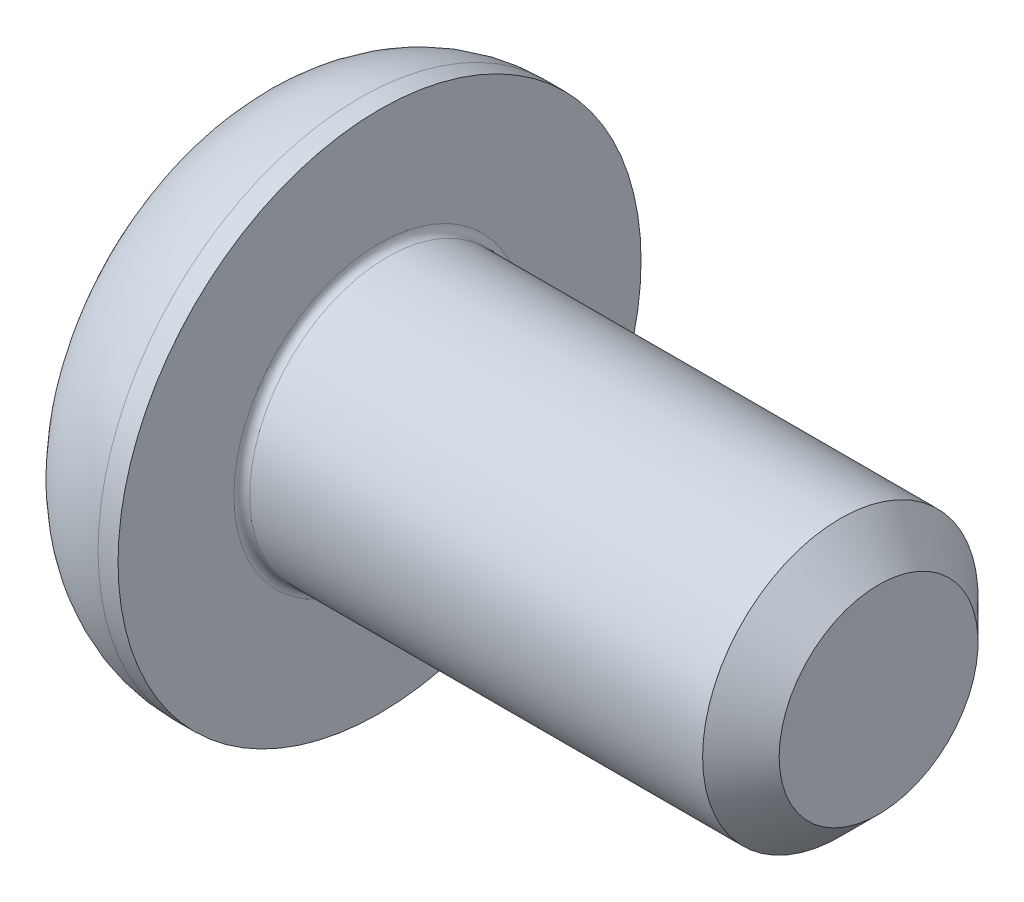
ISO-10303-21;
HEADER;
FILE_DESCRIPTION(('STEP AP214'),'2;1');
FILE_NAME('part.step','',(''),(''),'','','');
FILE_SCHEMA(('AUTOMOTIVE_DESIGN { 1 0 10303 214 1 1 1 1 }'));
ENDSEC;
DATA;
#1=APPLICATION_CONTEXT('core data for automotive mechanical design processes');
#2=APPLICATION_PROTOCOL_DEFINITION('international standard','automotive_design',2000,#1);
#3=PRODUCT_CONTEXT('',#1,'mechanical');
#4=PRODUCT('Part','Part','',(#3));
#5=PRODUCT_RELATED_PRODUCT_CATEGORY('part','',(#4));
#6=PRODUCT_DEFINITION_FORMATION('','',#4);
#7=PRODUCT_DEFINITION_CONTEXT('part definition',#1,'design');
#8=PRODUCT_DEFINITION('design','',#6,#7);
#9=PRODUCT_DEFINITION_SHAPE('','',#8);
#10=(LENGTH_UNIT() NAMED_UNIT(*) SI_UNIT(.MILLI.,.METRE.));
#11=(NAMED_UNIT(*) PLANE_ANGLE_UNIT() SI_UNIT($,.RADIAN.));
#12=(NAMED_UNIT(*) SI_UNIT($,.STERADIAN.) SOLID_ANGLE_UNIT());
#13=UNCERTAINTY_MEASURE_WITH_UNIT(LENGTH_MEASURE(1.E-05),#10,'distance_accuracy_value','');
#14=(GEOMETRIC_REPRESENTATION_CONTEXT(3) GLOBAL_UNCERTAINTY_ASSIGNED_CONTEXT((#13)) GLOBAL_UNIT_ASSIGNED_CONTEXT((#10,
#11,#12)) REPRESENTATION_CONTEXT('',''));
#15=CARTESIAN_POINT('',(0.,0.,0.));
#16=DIRECTION('',(0.,0.,1.));
#17=DIRECTION('',(1.,0.,0.));
#18=AXIS2_PLACEMENT_3D('',#15,#16,#17);
#19=CARTESIAN_POINT('',(-0.740562400835643,0.,0.));
#20=DIRECTION('',(-1.,0.,0.));
#21=DIRECTION('',(0.,0.,1.));
#22=AXIS2_PLACEMENT_3D('',#19,#20,#21);
#23=CONICAL_SURFACE('',#22,1.15070943138562,1.04719754964716);
#24=DIRECTION('',(0.500000001335913,0.,-0.866025403013149));
#25=VECTOR('',#24,1.);
#26=CARTESIAN_POINT('',(-288097.861551952,0.,499000.));
#27=LINE('',#26,#25);
#28=CARTESIAN_POINT('',(-0.0761999984888462,0.,0.));
#29=VERTEX_POINT('',#28);
#30=CARTESIAN_POINT('',(-0.736600000919907,-1.24473172570077E-11,1.14384635336222));
#31=VERTEX_POINT('',#30);
#32=EDGE_CURVE('E62',#29,#31,#27,.F.);
#33=ORIENTED_EDGE('',*,*,#32,.T.);
#34=CARTESIAN_POINT('',(-0.73660000085016,2.05188233828206E-11,1.14384635329467));
#35=CARTESIAN_POINT('',(-0.722085504291349,0.0435308707467442,1.1187137933705));
#36=CARTESIAN_POINT('',(-0.708885329304883,0.0874374993310474,1.09336428954129));
#37=CARTESIAN_POINT('',(-0.685844820326603,0.17601097040793,1.0422263721743));
#38=CARTESIAN_POINT('',(-0.676012636303893,0.220679386167398,1.01643705031045));
#39=CARTESIAN_POINT('',(-0.660708133023767,0.309462664397894,0.96517800072393));
#40=CARTESIAN_POINT('',(-0.655133941937477,0.35356387024999,0.939716157653854));
#41=CARTESIAN_POINT('',(-0.648480765502142,0.441973684437161,0.888672727634045));
#42=CARTESIAN_POINT('',(-0.647396269425927,0.486281971647088,0.863091326086003));
#43=CARTESIAN_POINT('',(-0.649658154068187,0.56906725298115,0.815295221622805));
#44=CARTESIAN_POINT('',(-0.652449167136933,0.607556669711444,0.793073346512631));
#45=CARTESIAN_POINT('',(-0.661293251651696,0.684284757175143,0.748774364561068));
#46=CARTESIAN_POINT('',(-0.667349341262812,0.722523162724656,0.726697410823672));
#47=CARTESIAN_POINT('',(-0.682488393131213,0.79940931728526,0.682307168791149));
#48=CARTESIAN_POINT('',(-0.691635498898952,0.838047340224703,0.659999495846107));
#49=CARTESIAN_POINT('',(-0.712395561915537,0.914747266663626,0.615716772669772));
#50=CARTESIAN_POINT('',(-0.724003644506823,0.952810152019836,0.593741155563231));
#51=CARTESIAN_POINT('',(-0.736600000841433,0.990599999968493,0.571923176677438));
#52=B_SPLINE_CURVE_WITH_KNOTS('',3,(#34,#35,#36,#37,#38,#39,#40,#41,#42,#43,#44,#45,#46,#47,#48,
#49,#50,#51),.UNSPECIFIED.,.F.,.F.,(4,2,2,2,2,2,2,2,4),(0.,0.157018030617418,0.314413377763407,
0.467913677583317,0.621225512591061,0.754692464982375,0.888283003356783,1.02483593973225,
1.16112088033698),.UNSPECIFIED.);
#53=CARTESIAN_POINT('',(-0.73660000084386,0.990599999984441,0.571923176658222));
#54=VERTEX_POINT('',#53);
#55=EDGE_CURVE('E146',#31,#54,#52,.T.);
#56=ORIENTED_EDGE('',*,*,#55,.T.);
#57=CARTESIAN_POINT('',(-0.736600000850875,0.990599999992193,0.571923176637869));
#58=CARTESIAN_POINT('',(-0.722085504292926,0.990599999997196,0.521658056777787));
#59=CARTESIAN_POINT('',(-0.70888532930671,0.990599999999249,0.470959049114572));
#60=CARTESIAN_POINT('',(-0.685844820328368,0.990600000000753,0.368683214377091));
#61=CARTESIAN_POINT('',(-0.676012636305345,0.9906000000002,0.317104570650696));
#62=CARTESIAN_POINT('',(-0.660708133024702,0.990599999999806,0.214586471478544));
#63=CARTESIAN_POINT('',(-0.655133941938209,0.990599999999948,0.163662785338006));
#64=CARTESIAN_POINT('',(-0.64848076550243,0.990600000000052,0.0615759252980307));
#65=CARTESIAN_POINT('',(-0.647396269425972,0.990600000000013,0.0104131222019735));
#66=CARTESIAN_POINT('',(-0.64965815406773,0.990599999999989,-0.0851790867213703));
#67=CARTESIAN_POINT('',(-0.652449167135969,0.990599999999997,-0.129622836938685));
#68=CARTESIAN_POINT('',(-0.661293251649302,0.990600000000003,-0.218220800835786));
#69=CARTESIAN_POINT('',(-0.667349341259495,0.990600000000001,-0.262374708307588));
#70=CARTESIAN_POINT('',(-0.682488393125703,0.990599999999999,-0.351155192366579));
#71=CARTESIAN_POINT('',(-0.691635498892158,0.9906,-0.395770538253603));
#72=CARTESIAN_POINT('',(-0.712395561905956,0.990600000000001,-0.484335984600263));
#73=CARTESIAN_POINT('',(-0.72400364449574,0.990600000000001,-0.528287218810394));
#74=CARTESIAN_POINT('',(-0.736600000828789,0.9906,-0.571923176579067));
#75=B_SPLINE_CURVE_WITH_KNOTS('',3,(#57,#58,#59,#60,#61,#62,#63,#64,#65,#66,#67,#68,#69,#70,#71,
#72,#73,#74),.UNSPECIFIED.,.F.,.F.,(4,2,2,2,2,2,2,2,4),(0.,0.157018030617455,0.314413377763538,
0.467913677583674,0.621225512591623,0.754692464973727,0.888283003338903,1.02483593970461,
1.16112088029964),.UNSPECIFIED.);
#76=CARTESIAN_POINT('',(-0.736600000847176,0.990600000020446,-0.571923176607345));
#77=VERTEX_POINT('',#76);
#78=EDGE_CURVE('E140',#54,#77,#75,.T.);
#79=ORIENTED_EDGE('',*,*,#78,.T.);
#80=CARTESIAN_POINT('',(-0.736600000883393,0.990600000021682,-0.571923176612645));
#81=CARTESIAN_POINT('',(-0.722085504315034,0.947069129307902,-0.597055736559139));
#82=CARTESIAN_POINT('',(-0.708885329323373,0.903162500727498,-0.6224052403982));
#83=CARTESIAN_POINT('',(-0.685844820338626,0.814589029650879,-0.673543157773912));
#84=CARTESIAN_POINT('',(-0.67601263631465,0.769920613887759,-0.699332479636607));
#85=CARTESIAN_POINT('',(-0.660708133031173,0.681137335652191,-0.750591529223731));
#86=CARTESIAN_POINT('',(-0.655133941942797,0.63703612979863,-0.776053372295494));
#87=CARTESIAN_POINT('',(-0.648480765503857,0.548626315607834,-0.827096802318007));
#88=CARTESIAN_POINT('',(-0.647396269426125,0.504318028395746,-0.852678203867068));
#89=CARTESIAN_POINT('',(-0.649658154065946,0.421532747056655,-0.900474308333025));
#90=CARTESIAN_POINT('',(-0.652449167133815,0.383043330323489,-0.922696183444906));
#91=CARTESIAN_POINT('',(-0.66129325164741,0.306315242854024,-0.966995165399833));
#92=CARTESIAN_POINT('',(-0.667349341258233,0.268076837301616,-0.989072119138889));
#93=CARTESIAN_POINT('',(-0.682488393126598,0.191190682735009,-1.03346236117487));
#94=CARTESIAN_POINT('',(-0.691635498894621,0.152552659792462,-1.0557700341217));
#95=CARTESIAN_POINT('',(-0.712395561912227,0.0758527333473867,-1.1000527573016));
#96=CARTESIAN_POINT('',(-0.724003644504253,0.0377898479881293,-1.1220283744099));
#97=CARTESIAN_POINT('',(-0.736600000839771,3.64698341529159E-11,-1.14384635329742));
#98=B_SPLINE_CURVE_WITH_KNOTS('',3,(#80,#81,#82,#83,#84,#85,#86,#87,#88,#89,#90,#91,#92,#93,#94,
#95,#96,#97),.UNSPECIFIED.,.F.,.F.,(4,2,2,2,2,2,2,2,4),(0.,0.157018030625824,0.314413377779975,
0.467913677606949,0.621225512621862,0.754692465022989,0.888283003407159,1.02483593979331,
1.16112088040879),.UNSPECIFIED.);
#99=CARTESIAN_POINT('',(-0.736600000808928,1.78029691194101E-11,-1.14384635325688));
#100=VERTEX_POINT('',#99);
#101=EDGE_CURVE('E65',#77,#100,#98,.T.);
#102=ORIENTED_EDGE('',*,*,#101,.T.);
#103=CARTESIAN_POINT('',(-0.736600000777798,0.,-1.14384635321585));
#104=CARTESIAN_POINT('',(-0.709083334027792,-1.56402245974853E-07,-1.09618608848213));
#105=CARTESIAN_POINT('',(-0.681566667261243,-2.93254204537796E-07,-1.0485258237579));
#106=CARTESIAN_POINT('',(-0.626533333709198,-5.27857561942893E-07,-0.953205294290451));
#107=CARTESIAN_POINT('',(-0.599016666923701,-6.25608960766691E-07,-0.905545029547232));
#108=CARTESIAN_POINT('',(-0.543983333420783,-7.82011199356134E-07,-0.810224500130085));
#109=CARTESIAN_POINT('',(-0.516466666703361,-8.40662039188637E-07,-0.762564235456156));
#110=CARTESIAN_POINT('',(-0.461433333202196,-9.18863158360247E-07,-0.667243706037989));
#111=CARTESIAN_POINT('',(-0.433916666418453,-9.38413437632551E-07,-0.61958344129375));
#112=CARTESIAN_POINT('',(-0.378883332869352,-9.38413436743213E-07,-0.524262911843524));
#113=CARTESIAN_POINT('',(-0.351366666103994,-9.18863156611639E-07,-0.476602647137537));
#114=CARTESIAN_POINT('',(-0.296333332582219,-8.40662036677753E-07,-0.38128211770151));
#115=CARTESIAN_POINT('',(-0.268816665825801,-7.82011196863797E-07,-0.333621852971469));
#116=CARTESIAN_POINT('',(-0.213783332304579,-6.25608957365991E-07,-0.238301323535259));
#117=CARTESIAN_POINT('',(-0.186266665539773,-5.2785755769381E-07,-0.19064105882909));
#118=CARTESIAN_POINT('',(-0.131233332010161,-2.93254198641545E-07,-0.0953205294168559));
#119=CARTESIAN_POINT('',(-0.103716665245355,-1.56402239261465E-07,-0.0476602647107909));
#120=CARTESIAN_POINT('',(-0.0761999984888462,0.,0.));
#121=B_SPLINE_CURVE_WITH_KNOTS('',3,(#103,#104,#105,#106,#107,#108,#109,#110,#111,#112,#113,
#114,#115,#116,#117,#118,#119,#120),.UNSPECIFIED.,.F.,.F.,(4,2,2,2,2,2,2,2,4),(0.,
0.165100000157146,0.330200000391796,0.495300000344144,0.660400000578565,0.825500000686024,
0.990600000842649,1.15570000095,1.32080000105734),.UNSPECIFIED.);
#122=EDGE_CURVE('E59',#100,#29,#121,.T.);
#123=ORIENTED_EDGE('',*,*,#122,.T.);
#124=EDGE_LOOP('',(#33,#56,#79,#102,#123));
#125=FACE_BOUND('',#124,.T.);
#126=ADVANCED_FACE('F16',(#125),#23,.F.);
#127=CARTESIAN_POINT('',(-0.740562400778799,0.,0.));
#128=DIRECTION('',(-1.,0.,0.));
#129=DIRECTION('',(0.,0.,1.));
#130=AXIS2_PLACEMENT_3D('',#127,#128,#129);
#131=CONICAL_SURFACE('',#130,1.15070943132878,1.04719754966282);
#132=ORIENTED_EDGE('',*,*,#122,.F.);
#133=CARTESIAN_POINT('',(-0.736600000834363,-1.14031935671389E-11,-1.14384635328799));
#134=CARTESIAN_POINT('',(-0.722085504271769,-0.0435308707404993,-1.11871379336982));
#135=CARTESIAN_POINT('',(-0.708885329283877,-0.0874374993262336,-1.09336428954292));
#136=CARTESIAN_POINT('',(-0.685844820304793,-0.176010970404633,-1.04222637217736));
#137=CARTESIAN_POINT('',(-0.676012636282707,-0.220679386164182,-1.01643705031261));
#138=CARTESIAN_POINT('',(-0.660708133003157,-0.309462664395121,-0.965178000725234));
#139=CARTESIAN_POINT('',(-0.655133941916835,-0.353563870247572,-0.939716157655171));
#140=CARTESIAN_POINT('',(-0.64848076548147,-0.441973684435382,-0.888672727635152));
#141=CARTESIAN_POINT('',(-0.647396269405261,-0.486281971645594,-0.863091326086886));
#142=CARTESIAN_POINT('',(-0.649658154047434,-0.569067252981535,-0.815295221622567));
#143=CARTESIAN_POINT('',(-0.652449167116224,-0.607556669713416,-0.793073346511489));
#144=CARTESIAN_POINT('',(-0.661293251631227,-0.684284757180263,-0.748774364558119));
#145=CARTESIAN_POINT('',(-0.667349341242538,-0.722523162731337,-0.726697410819817));
#146=CARTESIAN_POINT('',(-0.682488393111449,-0.79940931729513,-0.682307168785451));
#147=CARTESIAN_POINT('',(-0.691635498879511,-0.838047340236201,-0.65999949583947));
#148=CARTESIAN_POINT('',(-0.712395561896823,-0.914747266678381,-0.615716772661256));
#149=CARTESIAN_POINT('',(-0.724003644488516,-0.952810152036219,-0.593741155553775));
#150=CARTESIAN_POINT('',(-0.736600000823554,-0.9905999999865,-0.571923176667043));
#151=B_SPLINE_CURVE_WITH_KNOTS('',3,(#133,#134,#135,#136,#137,#138,#139,#140,#141,#142,#143,
#144,#145,#146,#147,#148,#149,#150),.UNSPECIFIED.,.F.,.F.,(4,2,2,2,2,2,2,2,4),(0.,
0.157018030618734,0.314413377765814,0.467913677586693,0.6212255125955,0.754692464992289,
0.888283003372133,1.02483593975331,1.16112088036381),.UNSPECIFIED.);
#152=CARTESIAN_POINT('',(-0.736600000826083,-0.990599999994092,-0.571923176662655));
#153=VERTEX_POINT('',#152);
#154=EDGE_CURVE('E72',#100,#153,#151,.T.);
#155=ORIENTED_EDGE('',*,*,#154,.T.);
#156=CARTESIAN_POINT('',(-0.736600000823892,-0.990599999992759,-0.571923176628409));
#157=CARTESIAN_POINT('',(-0.722085504266965,-0.990599999997399,-0.521658056768604));
#158=CARTESIAN_POINT('',(-0.708885329281608,-0.990599999999303,-0.470959049105734));
#159=CARTESIAN_POINT('',(-0.685844820304742,-0.990600000000699,-0.368683214369053));
#160=CARTESIAN_POINT('',(-0.676012636282337,-0.990600000000185,-0.317104570643112));
#161=CARTESIAN_POINT('',(-0.660708133002743,-0.99059999999982,-0.21458647147184));
#162=CARTESIAN_POINT('',(-0.655133941916692,-0.990599999999952,-0.163662785331725));
#163=CARTESIAN_POINT('',(-0.648480765481555,-0.990600000000048,-0.0615759252926351));
#164=CARTESIAN_POINT('',(-0.6473962694053,-0.990600000000012,-0.0104131221970409));
#165=CARTESIAN_POINT('',(-0.649658154047304,-0.99059999999999,0.0851790867296394));
#166=CARTESIAN_POINT('',(-0.652449167115944,-0.990599999999997,0.129622836950745));
#167=CARTESIAN_POINT('',(-0.66129325163049,-0.990600000000003,0.218220800855376));
#168=CARTESIAN_POINT('',(-0.667349341241494,-0.990600000000001,0.26237470833092));
#169=CARTESIAN_POINT('',(-0.682488393109656,-0.990599999999999,0.351155192397433));
#170=CARTESIAN_POINT('',(-0.691635498877264,-0.9906,0.395770538288237));
#171=CARTESIAN_POINT('',(-0.712395561893575,-0.990600000000001,0.484335984642363));
#172=CARTESIAN_POINT('',(-0.724003644484719,-0.990600000000001,0.52828721885618));
#173=CARTESIAN_POINT('',(-0.73660000081918,-0.9906,0.571923176628509));
#174=B_SPLINE_CURVE_WITH_KNOTS('',3,(#156,#157,#158,#159,#160,#161,#162,#163,#164,#165,#166,
#167,#168,#169,#170,#171,#172,#173),.UNSPECIFIED.,.F.,.F.,(4,2,2,2,2,2,2,2,4),(0.,
0.157018030615817,0.314413377760227,0.467913677578972,0.621225512585544,0.754692464979047,
0.888283003355655,1.02483593973316,1.16112088033991),.UNSPECIFIED.);
#175=CARTESIAN_POINT('',(-0.736600000821811,-0.99059999999409,0.571923176647859));
#176=VERTEX_POINT('',#175);
#177=EDGE_CURVE('E157',#153,#176,#174,.T.);
#178=ORIENTED_EDGE('',*,*,#177,.T.);
#179=CARTESIAN_POINT('',(-0.736600000831496,-0.990599999980223,0.571923176656539));
#180=CARTESIAN_POINT('',(-0.722085504272169,-0.947069129261244,0.597055736593244));
#181=CARTESIAN_POINT('',(-0.70888532928555,-0.903162500679849,0.622405240427631));
#182=CARTESIAN_POINT('',(-0.685844820307191,-0.814589029604983,0.673543157798485));
#183=CARTESIAN_POINT('',(-0.676012636284554,-0.769920613844615,0.699332479661007));
#184=CARTESIAN_POINT('',(-0.660708133004281,-0.681137335613349,0.750591529246653));
#185=CARTESIAN_POINT('',(-0.655133941917783,-0.637036129761355,0.776053372317147));
#186=CARTESIAN_POINT('',(-0.648480765481894,-0.548626315574103,0.827096802337349));
#187=CARTESIAN_POINT('',(-0.647396269405334,-0.504318028363992,0.852678203885367));
#188=CARTESIAN_POINT('',(-0.649658154046841,-0.421532747028949,0.90047430834905));
#189=CARTESIAN_POINT('',(-0.652449167115257,-0.383043330297854,0.922696183459714));
#190=CARTESIAN_POINT('',(-0.661293251629406,-0.306315242832519,0.966995165412242));
#191=CARTESIAN_POINT('',(-0.667349341240237,-0.26807683728217,0.989072119150113));
#192=CARTESIAN_POINT('',(-0.682488393108109,-0.19119068271989,1.0334623611836));
#193=CARTESIAN_POINT('',(-0.691635498875602,-0.152552659779605,1.05577003412913));
#194=CARTESIAN_POINT('',(-0.712395561891739,-0.0758527333389797,1.10005275730645));
#195=CARTESIAN_POINT('',(-0.724003644482825,-0.0377898479819096,1.12202837441349));
#196=CARTESIAN_POINT('',(-0.736600000817251,-3.23860901403284E-11,1.14384635329978));
#197=B_SPLINE_CURVE_WITH_KNOTS('',3,(#179,#180,#181,#182,#183,#184,#185,#186,#187,#188,#189,
#190,#191,#192,#193,#194,#195,#196),.UNSPECIFIED.,.F.,.F.,(4,2,2,2,2,2,2,2,4),(0.,
0.157018030617755,0.314413377764033,0.467913677584393,0.621225512592611,0.754692464986673,
0.88828300336382,1.024835939742,1.16112088034945),.UNSPECIFIED.);
#198=EDGE_CURVE('E70',#176,#31,#197,.T.);
#199=ORIENTED_EDGE('',*,*,#198,.T.);
#200=ORIENTED_EDGE('',*,*,#32,.F.);
#201=EDGE_LOOP('',(#132,#155,#178,#199,#200));
#202=FACE_BOUND('',#201,.T.);
#203=ADVANCED_FACE('F68',(#202),#131,.F.);
#204=CARTESIAN_POINT('',(-1.8542,0.,-1.14384635331849));
#205=DIRECTION('',(0.,-0.5,-0.866025403784439));
#206=DIRECTION('',(0.,0.866025403784439,-0.5));
#207=AXIS2_PLACEMENT_3D('',#204,#205,#206);
#208=PLANE('',#207);
#209=DIRECTION('',(0.,0.866025403784437,-0.500000000000003));
#210=VECTOR('',#209,1.);
#211=CARTESIAN_POINT('',(-1.8542,-0.990600000000003,-0.571923176659239));
#212=LINE('',#211,#210);
#213=CARTESIAN_POINT('',(-1.8542,-0.9906,-0.571923176659239));
#214=VERTEX_POINT('',#213);
#215=CARTESIAN_POINT('',(-1.8542,2.28170200158127E-11,-1.1438463533077));
#216=VERTEX_POINT('',#215);
#217=EDGE_CURVE('E89',#214,#216,#212,.T.);
#218=ORIENTED_EDGE('',*,*,#217,.F.);
#219=DIRECTION('',(1.,0.,0.));
#220=VECTOR('',#219,1.);
#221=CARTESIAN_POINT('',(-1.8542,-0.9906,-0.571923176659239));
#222=LINE('',#221,#220);
#223=EDGE_CURVE('E134',#214,#153,#222,.T.);
#224=ORIENTED_EDGE('',*,*,#223,.T.);
#225=ORIENTED_EDGE('',*,*,#154,.F.);
#226=DIRECTION('',(1.,0.,0.));
#227=VECTOR('',#226,1.);
#228=CARTESIAN_POINT('',(-1.8542,4.97880816435758E-11,-1.14384635328973));
#229=LINE('',#228,#227);
#230=EDGE_CURVE('E137',#100,#216,#229,.F.);
#231=ORIENTED_EDGE('',*,*,#230,.T.);
#232=EDGE_LOOP('',(#218,#224,#225,#231));
#233=FACE_BOUND('',#232,.T.);
#234=ADVANCED_FACE('F107',(#233),#208,.F.);
#235=CARTESIAN_POINT('',(-1.8542,0.9906,-0.571923176659233));
#236=DIRECTION('',(0.,0.5,-0.866025403784439));
#237=DIRECTION('',(0.,0.866025403784439,0.5));
#238=AXIS2_PLACEMENT_3D('',#235,#236,#237);
#239=PLANE('',#238);
#240=DIRECTION('',(0.,0.866025403784436,0.500000000000005));
#241=VECTOR('',#240,1.);
#242=CARTESIAN_POINT('',(-1.8542,0.,-1.14384635331849));
#243=LINE('',#242,#241);
#244=CARTESIAN_POINT('',(-1.8542,0.9906,-0.571923176587358));
#245=VERTEX_POINT('',#244);
#246=EDGE_CURVE('E84',#216,#245,#243,.T.);
#247=ORIENTED_EDGE('',*,*,#246,.F.);
#248=ORIENTED_EDGE('',*,*,#230,.F.);
#249=ORIENTED_EDGE('',*,*,#101,.F.);
#250=DIRECTION('',(1.,0.,0.));
#251=VECTOR('',#250,1.);
#252=CARTESIAN_POINT('',(-1.8542,0.9906,-0.571923176544232));
#253=LINE('',#252,#251);
#254=EDGE_CURVE('E143',#77,#245,#253,.F.);
#255=ORIENTED_EDGE('',*,*,#254,.T.);
#256=EDGE_LOOP('',(#247,#248,#249,#255));
#257=FACE_BOUND('',#256,.T.);
#258=ADVANCED_FACE('F244',(#257),#239,.F.);
#259=CARTESIAN_POINT('',(-1.8542,0.9906,0.571923176659233));
#260=DIRECTION('',(0.,1.,0.));
#261=DIRECTION('',(0.,0.,1.));
#262=AXIS2_PLACEMENT_3D('',#259,#260,#261);
#263=PLANE('',#262);
#264=DIRECTION('',(0.,0.,1.));
#265=VECTOR('',#264,1.);
#266=CARTESIAN_POINT('',(-1.8542,0.9906,0.));
#267=LINE('',#266,#265);
#268=CARTESIAN_POINT('',(-1.8542,0.990599999968879,0.57192317667721));
#269=VERTEX_POINT('',#268);
#270=EDGE_CURVE('E80',#245,#269,#267,.T.);
#271=ORIENTED_EDGE('',*,*,#270,.F.);
#272=ORIENTED_EDGE('',*,*,#254,.F.);
#273=ORIENTED_EDGE('',*,*,#78,.F.);
#274=DIRECTION('',(1.,0.,0.));
#275=VECTOR('',#274,1.);
#276=CARTESIAN_POINT('',(-1.8542,0.990599999950207,0.571923176687994));
#277=LINE('',#276,#275);
#278=EDGE_CURVE('E149',#54,#269,#277,.F.);
#279=ORIENTED_EDGE('',*,*,#278,.T.);
#280=EDGE_LOOP('',(#271,#272,#273,#279));
#281=FACE_BOUND('',#280,.T.);
#282=ADVANCED_FACE('F247',(#281),#263,.F.);
#283=CARTESIAN_POINT('',(-1.8542,0.,1.14384635331849));
#284=DIRECTION('',(0.,0.500000000000001,0.866025403784438));
#285=DIRECTION('',(0.,-0.866025403784438,0.500000000000001));
#286=AXIS2_PLACEMENT_3D('',#283,#284,#285);
#287=PLANE('',#286);
#288=DIRECTION('',(0.,-0.866025403784436,0.500000000000004));
#289=VECTOR('',#288,1.);
#290=CARTESIAN_POINT('',(-1.8542,0.990600000000002,0.571923176659237));
#291=LINE('',#290,#289);
#292=CARTESIAN_POINT('',(-1.8542,-3.11167711731531E-11,1.14384635330051));
#293=VERTEX_POINT('',#292);
#294=EDGE_CURVE('E83',#269,#293,#291,.T.);
#295=ORIENTED_EDGE('',*,*,#294,.F.);
#296=ORIENTED_EDGE('',*,*,#278,.F.);
#297=ORIENTED_EDGE('',*,*,#55,.F.);
#298=DIRECTION('',(1.,0.,0.));
#299=VECTOR('',#298,1.);
#300=CARTESIAN_POINT('',(-1.8542,-4.97889490053138E-11,1.14384635328973));
#301=LINE('',#300,#299);
#302=EDGE_CURVE('E154',#31,#293,#301,.F.);
#303=ORIENTED_EDGE('',*,*,#302,.T.);
#304=EDGE_LOOP('',(#295,#296,#297,#303));
#305=FACE_BOUND('',#304,.T.);
#306=ADVANCED_FACE('F230',(#305),#287,.F.);
#307=CARTESIAN_POINT('',(-1.8542,-0.9906,0.571923176659233));
#308=DIRECTION('',(0.,-0.5,0.866025403784439));
#309=DIRECTION('',(0.,-0.866025403784439,-0.5));
#310=AXIS2_PLACEMENT_3D('',#307,#308,#309);
#311=PLANE('',#310);
#312=DIRECTION('',(0.,-0.866025403784436,-0.500000000000005));
#313=VECTOR('',#312,1.);
#314=CARTESIAN_POINT('',(-1.8542,0.,1.14384635331849));
#315=LINE('',#314,#313);
#316=CARTESIAN_POINT('',(-1.8542,-0.9906,0.571923176623295));
#317=VERTEX_POINT('',#316);
#318=EDGE_CURVE('E117',#293,#317,#315,.T.);
#319=ORIENTED_EDGE('',*,*,#318,.F.);
#320=ORIENTED_EDGE('',*,*,#302,.F.);
#321=ORIENTED_EDGE('',*,*,#198,.F.);
#322=DIRECTION('',(1.,0.,0.));
#323=VECTOR('',#322,1.);
#324=CARTESIAN_POINT('',(-1.8542,-0.9906,0.571923176601733));
#325=LINE('',#324,#323);
#326=EDGE_CURVE('E160',#176,#317,#325,.F.);
#327=ORIENTED_EDGE('',*,*,#326,.T.);
#328=EDGE_LOOP('',(#319,#320,#321,#327));
#329=FACE_BOUND('',#328,.T.);
#330=ADVANCED_FACE('F203',(#329),#311,.F.);
#331=CARTESIAN_POINT('',(-1.8542,-0.9906,-0.571923176659233));
#332=DIRECTION('',(0.,-1.,0.));
#333=DIRECTION('',(0.,0.,-1.));
#334=AXIS2_PLACEMENT_3D('',#331,#332,#333);
#335=PLANE('',#334);
#336=DIRECTION('',(0.,0.,1.));
#337=VECTOR('',#336,1.);
#338=CARTESIAN_POINT('',(-1.8542,-0.9906,0.));
#339=LINE('',#338,#337);
#340=EDGE_CURVE('E122',#317,#214,#339,.F.);
#341=ORIENTED_EDGE('',*,*,#340,.F.);
#342=ORIENTED_EDGE('',*,*,#326,.F.);
#343=ORIENTED_EDGE('',*,*,#177,.F.);
#344=ORIENTED_EDGE('',*,*,#223,.F.);
#345=EDGE_LOOP('',(#341,#342,#343,#344));
#346=FACE_BOUND('',#345,.T.);
#347=ADVANCED_FACE('F198',(#346),#335,.F.);
#348=CARTESIAN_POINT('',(-1.8542,2.23562317665923,0.));
#349=DIRECTION('',(-1.,0.,0.));
#350=DIRECTION('',(0.,0.,1.));
#351=AXIS2_PLACEMENT_3D('',#348,#349,#350);
#352=PLANE('',#351);
#353=CARTESIAN_POINT('',(-1.8542,0.,0.));
#354=DIRECTION('',(1.,0.,0.));
#355=DIRECTION('',(0.,1.,0.));
#356=AXIS2_PLACEMENT_3D('',#353,#354,#355);
#357=CIRCLE('',#356,1.7272);
#358=CARTESIAN_POINT('',(-1.8542,1.7272,0.));
#359=VERTEX_POINT('',#358);
#360=EDGE_CURVE('E125',#359,#359,#357,.T.);
#361=ORIENTED_EDGE('',*,*,#360,.F.);
#362=EDGE_LOOP('',(#361));
#363=FACE_BOUND('',#362,.T.);
#364=ORIENTED_EDGE('',*,*,#318,.T.);
#365=ORIENTED_EDGE('',*,*,#340,.T.);
#366=ORIENTED_EDGE('',*,*,#217,.T.);
#367=ORIENTED_EDGE('',*,*,#246,.T.);
#368=ORIENTED_EDGE('',*,*,#270,.T.);
#369=ORIENTED_EDGE('',*,*,#294,.T.);
#370=EDGE_LOOP('',(#364,#365,#366,#367,#368,#369));
#371=FACE_BOUND('',#370,.T.);
#372=ADVANCED_FACE('F195',(#363,#371),#352,.T.);
#373=CARTESIAN_POINT('',(-0.253999999999999,0.,0.));
#374=DIRECTION('',(1.,0.,0.));
#375=DIRECTION('',(0.,1.,0.));
#376=AXIS2_PLACEMENT_3D('',#373,#374,#375);
#377=TOROIDAL_SURFACE('',#376,1.7272,1.6002);
#378=CARTESIAN_POINT('',(-0.254,0.,0.));
#379=DIRECTION('',(1.,0.,0.));
#380=DIRECTION('',(0.,1.,0.));
#381=AXIS2_PLACEMENT_3D('',#378,#379,#380);
#382=CIRCLE('',#381,3.3274);
#383=CARTESIAN_POINT('',(-0.254,3.3274,0.));
#384=VERTEX_POINT('',#383);
#385=EDGE_CURVE('E167',#384,#384,#382,.T.);
#386=ORIENTED_EDGE('',*,*,#385,.F.);
#387=EDGE_LOOP('',(#386));
#388=FACE_BOUND('',#387,.T.);
#389=ORIENTED_EDGE('',*,*,#360,.T.);
#390=EDGE_LOOP('',(#389));
#391=FACE_BOUND('',#390,.T.);
#392=ADVANCED_FACE('F193',(#388,#391),#377,.T.);
#393=CARTESIAN_POINT('',(-0.9271,0.,0.));
#394=DIRECTION('',(1.,0.,0.));
#395=DIRECTION('',(0.,1.,0.));
#396=AXIS2_PLACEMENT_3D('',#393,#394,#395);
#397=CYLINDRICAL_SURFACE('',#396,3.3274);
#398=ORIENTED_EDGE('',*,*,#385,.T.);
#399=EDGE_LOOP('',(#398));
#400=FACE_BOUND('',#399,.T.);
#401=CARTESIAN_POINT('',(0.,0.,0.));
#402=DIRECTION('',(1.,0.,0.));
#403=DIRECTION('',(0.,1.,0.));
#404=AXIS2_PLACEMENT_3D('',#401,#402,#403);
#405=CIRCLE('',#404,3.3274);
#406=CARTESIAN_POINT('',(0.,3.3274,0.));
#407=VERTEX_POINT('',#406);
#408=EDGE_CURVE('E170',#407,#407,#405,.T.);
#409=ORIENTED_EDGE('',*,*,#408,.F.);
#410=EDGE_LOOP('',(#409));
#411=FACE_BOUND('',#410,.T.);
#412=ADVANCED_FACE('F187',(#400,#411),#397,.T.);
#413=CARTESIAN_POINT('',(0.,2.54,0.));
#414=DIRECTION('',(1.,0.,0.));
#415=DIRECTION('',(0.,0.,-1.));
#416=AXIS2_PLACEMENT_3D('',#413,#414,#415);
#417=PLANE('',#416);
#418=ORIENTED_EDGE('',*,*,#408,.T.);
#419=EDGE_LOOP('',(#418));
#420=FACE_BOUND('',#419,.T.);
#421=CARTESIAN_POINT('',(0.,0.,-1.85260000000001));
#422=CARTESIAN_POINT('',(0.,-0.352631427844514,-1.85270095715895));
#423=CARTESIAN_POINT('',(0.,-0.681932258934329,-1.72252580654826));
#424=CARTESIAN_POINT('',(0.,-1.03783647415147,-1.58183413363161));
#425=CARTESIAN_POINT('',(0.,-1.3099860228262,-1.3099860228262));
#426=CARTESIAN_POINT('',(0.,-1.58069267471613,-1.03957921062646));
#427=CARTESIAN_POINT('',(0.,-1.72252580654826,-0.681932258934332));
#428=CARTESIAN_POINT('',(0.,-1.85240412069324,-0.354430619896698));
#429=CARTESIAN_POINT('',(0.,-1.85260000000001,0.));
#430=CARTESIAN_POINT('',(0.,-1.85279475383466,0.352394152734893));
#431=CARTESIAN_POINT('',(0.,-1.72252580654826,0.681932258934326));
#432=CARTESIAN_POINT('',(0.,-1.58183413363077,1.03783647415248));
#433=CARTESIAN_POINT('',(0.,-1.3099860228262,1.3099860228262));
#434=CARTESIAN_POINT('',(0.,-1.03957921062632,1.5806926747161));
#435=CARTESIAN_POINT('',(0.,-0.681932258934329,1.72252580654826));
#436=CARTESIAN_POINT('',(0.,-0.35419239075698,1.85249859594278));
#437=CARTESIAN_POINT('',(0.,0.,1.85260000000001));
#438=B_SPLINE_CURVE_WITH_KNOTS('',2,(#421,#422,#423,#424,#425,#426,#427,#428,#429,#430,#431,
#432,#433,#434,#435,#436,#437),.UNSPECIFIED.,.F.,.F.,(3,2,2,2,2,2,2,2,3),(0.,0.125,0.25,0.375,
0.5,0.625,0.75,0.875,1.),.UNSPECIFIED.);
#439=CARTESIAN_POINT('',(0.,0.,-1.85260000000001));
#440=VERTEX_POINT('',#439);
#441=CARTESIAN_POINT('',(0.,0.,1.85260000000001));
#442=VERTEX_POINT('',#441);
#443=EDGE_CURVE('E33',#440,#442,#438,.T.);
#444=ORIENTED_EDGE('',*,*,#443,.T.);
#445=CARTESIAN_POINT('',(0.,0.,1.85260000000001));
#446=CARTESIAN_POINT('',(0.,0.352631427845278,1.85270095715895));
#447=CARTESIAN_POINT('',(0.,0.681932258934328,1.72252580654826));
#448=CARTESIAN_POINT('',(0.,1.03783647415174,1.58183413363118));
#449=CARTESIAN_POINT('',(0.,1.3099860228262,1.3099860228262));
#450=CARTESIAN_POINT('',(0.,1.58069283245354,1.03957905306392));
#451=CARTESIAN_POINT('',(0.,1.72252580654827,0.681932258934328));
#452=CARTESIAN_POINT('',(0.,1.85250572994461,0.354174181515266));
#453=CARTESIAN_POINT('',(0.,1.85260000000001,0.));
#454=CARTESIAN_POINT('',(0.,1.85269386419692,-0.352649364378629));
#455=CARTESIAN_POINT('',(0.,1.72252580654826,-0.681932258934331));
#456=CARTESIAN_POINT('',(0.,1.58183413812533,-1.03783646965261));
#457=CARTESIAN_POINT('',(0.,1.3099860228262,-1.30998602282621));
#458=CARTESIAN_POINT('',(0.,1.039579210627,-1.58069267471575));
#459=CARTESIAN_POINT('',(0.,0.681932258934328,-1.72252580654826));
#460=CARTESIAN_POINT('',(0.,0.354192390757165,-1.85249859594278));
#461=CARTESIAN_POINT('',(0.,0.,-1.85260000000001));
#462=B_SPLINE_CURVE_WITH_KNOTS('',2,(#445,#446,#447,#448,#449,#450,#451,#452,#453,#454,#455,
#456,#457,#458,#459,#460,#461),.UNSPECIFIED.,.F.,.F.,(3,2,2,2,2,2,2,2,3),(0.,0.125,0.25,0.375,
0.5,0.625,0.75,0.875,1.),.UNSPECIFIED.);
#463=EDGE_CURVE('E171',#442,#440,#462,.T.);
#464=ORIENTED_EDGE('',*,*,#463,.T.);
#465=EDGE_LOOP('',(#444,#464));
#466=FACE_BOUND('',#465,.T.);
#467=ADVANCED_FACE('F176',(#420,#466),#417,.T.);
#468=CARTESIAN_POINT('',(6.35,0.8763,0.));
#469=DIRECTION('',(1.,0.,0.));
#470=DIRECTION('',(0.,0.,-1.));
#471=AXIS2_PLACEMENT_3D('',#468,#469,#470);
#472=PLANE('',#471);
#473=CARTESIAN_POINT('',(6.3500000003387,0.,0.));
#474=DIRECTION('',(-1.,0.,0.));
#475=DIRECTION('',(0.,0.,1.));
#476=AXIS2_PLACEMENT_3D('',#473,#474,#475);
#477=CIRCLE('',#476,1.26568200010979);
#478=CARTESIAN_POINT('',(6.3500000003387,0.,1.26568200010979));
#479=VERTEX_POINT('',#478);
#480=EDGE_CURVE('E96',#479,#479,#477,.T.);
#481=ORIENTED_EDGE('',*,*,#480,.F.);
#482=EDGE_LOOP('',(#481));
#483=FACE_BOUND('',#482,.T.);
#484=ADVANCED_FACE('F186',(#483),#472,.T.);
#485=CARTESIAN_POINT('',(0.100000000000006,0.,0.));
#486=DIRECTION('',(1.,0.,0.));
#487=DIRECTION('',(0.,1.,0.));
#488=AXIS2_PLACEMENT_3D('',#485,#486,#487);
#489=TOROIDAL_SURFACE('',#488,1.85260000000001,0.100000000000006);
#490=ORIENTED_EDGE('',*,*,#443,.F.);
#491=ORIENTED_EDGE('',*,*,#463,.F.);
#492=EDGE_LOOP('',(#490,#491));
#493=FACE_BOUND('',#492,.T.);
#494=CARTESIAN_POINT('',(0.100000000000006,0.,0.));
#495=DIRECTION('',(1.,0.,0.));
#496=DIRECTION('',(0.,1.,0.));
#497=AXIS2_PLACEMENT_3D('',#494,#495,#496);
#498=CIRCLE('',#497,1.7526);
#499=CARTESIAN_POINT('',(0.100000000000006,1.7526,0.));
#500=VERTEX_POINT('',#499);
#501=EDGE_CURVE('E20',#500,#500,#498,.T.);
#502=ORIENTED_EDGE('',*,*,#501,.F.);
#503=EDGE_LOOP('',(#502));
#504=FACE_BOUND('',#503,.T.);
#505=ADVANCED_FACE('F18',(#493,#504),#489,.F.);
#506=CARTESIAN_POINT('',(5.86308199984842,0.,0.));
#507=DIRECTION('',(-1.,0.,0.));
#508=DIRECTION('',(0.,0.,1.));
#509=AXIS2_PLACEMENT_3D('',#506,#507,#508);
#510=CONICAL_SURFACE('',#509,1.75259999969057,0.785398162463518);
#511=CARTESIAN_POINT('',(5.863082,0.,0.));
#512=DIRECTION('',(1.,0.,0.));
#513=DIRECTION('',(0.,1.,0.));
#514=AXIS2_PLACEMENT_3D('',#511,#512,#513);
#515=CIRCLE('',#514,1.7526);
#516=CARTESIAN_POINT('',(5.863082,1.7526,0.));
#517=VERTEX_POINT('',#516);
#518=EDGE_CURVE('E11',#517,#517,#515,.F.);
#519=ORIENTED_EDGE('',*,*,#518,.F.);
#520=EDGE_LOOP('',(#519));
#521=FACE_BOUND('',#520,.T.);
#522=ORIENTED_EDGE('',*,*,#480,.T.);
#523=EDGE_LOOP('',(#522));
#524=FACE_BOUND('',#523,.T.);
#525=ADVANCED_FACE('F260',(#521,#524),#510,.T.);
#526=CARTESIAN_POINT('',(3.9701199998,0.,0.));
#527=DIRECTION('',(1.,0.,0.));
#528=DIRECTION('',(0.,1.,0.));
#529=AXIS2_PLACEMENT_3D('',#526,#527,#528);
#530=CYLINDRICAL_SURFACE('',#529,1.7526);
#531=ORIENTED_EDGE('',*,*,#518,.T.);
#532=EDGE_LOOP('',(#531));
#533=FACE_BOUND('',#532,.T.);
#534=ORIENTED_EDGE('',*,*,#501,.T.);
#535=EDGE_LOOP('',(#534));
#536=FACE_BOUND('',#535,.T.);
#537=ADVANCED_FACE('F258',(#533,#536),#530,.T.);
#538=CLOSED_SHELL('',(#126,#203,#234,#258,#282,#306,#330,#347,#372,#392,#412,#467,#484,#505,
#525,#537));
#539=MANIFOLD_SOLID_BREP('B1',#538);
#540=ADVANCED_BREP_SHAPE_REPRESENTATION('',(#18,#539),#14);
#541=SHAPE_DEFINITION_REPRESENTATION(#9,#540);
ENDSEC;
END-ISO-10303-21;
